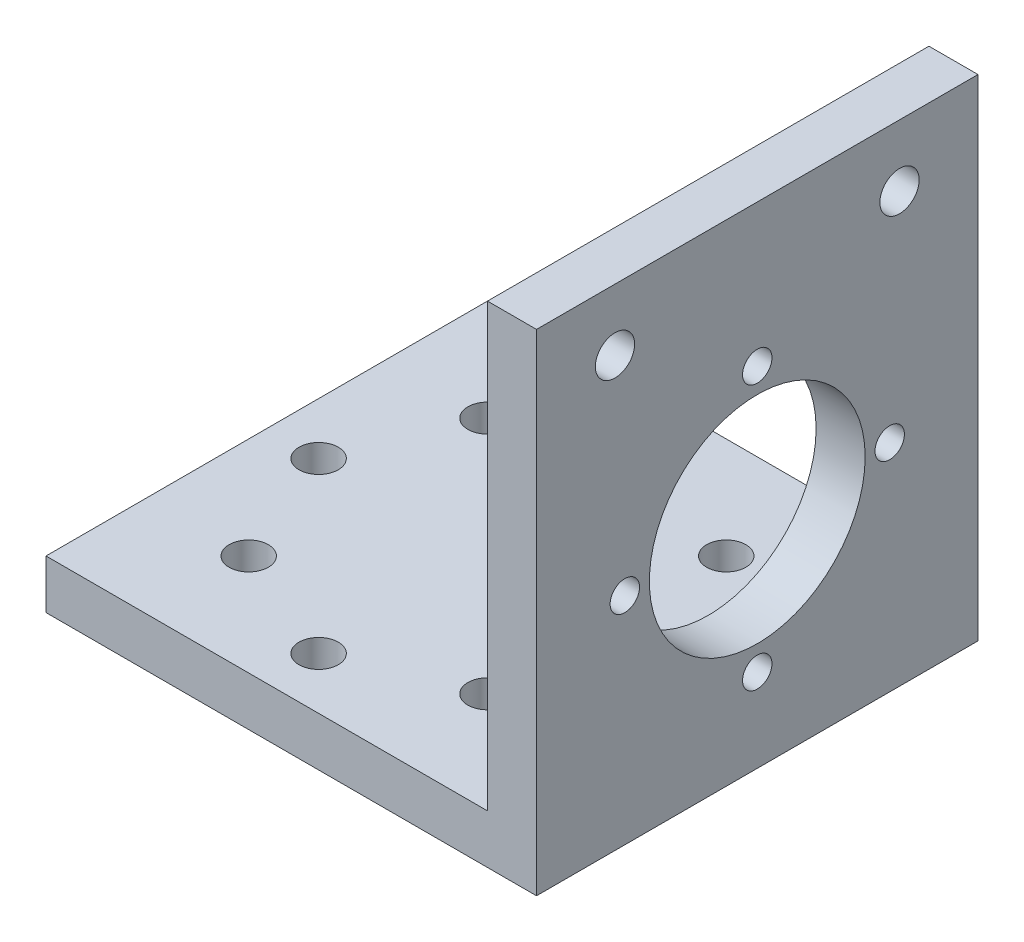
ISO-10303-21;
HEADER;
FILE_DESCRIPTION(('STEP AP214'),'2;1');
FILE_NAME('part.step','',(''),(''),'','','');
FILE_SCHEMA(('AUTOMOTIVE_DESIGN { 1 0 10303 214 1 1 1 1 }'));
ENDSEC;
DATA;
#1=APPLICATION_CONTEXT('core data for automotive mechanical design processes');
#2=APPLICATION_PROTOCOL_DEFINITION('international standard','automotive_design',2000,#1);
#3=PRODUCT_CONTEXT('',#1,'mechanical');
#4=PRODUCT('Part','Part','',(#3));
#5=PRODUCT_RELATED_PRODUCT_CATEGORY('part','',(#4));
#6=PRODUCT_DEFINITION_FORMATION('','',#4);
#7=PRODUCT_DEFINITION_CONTEXT('part definition',#1,'design');
#8=PRODUCT_DEFINITION('design','',#6,#7);
#9=PRODUCT_DEFINITION_SHAPE('','',#8);
#10=(LENGTH_UNIT() NAMED_UNIT(*) SI_UNIT(.MILLI.,.METRE.));
#11=(NAMED_UNIT(*) PLANE_ANGLE_UNIT() SI_UNIT($,.RADIAN.));
#12=(NAMED_UNIT(*) SI_UNIT($,.STERADIAN.) SOLID_ANGLE_UNIT());
#13=UNCERTAINTY_MEASURE_WITH_UNIT(LENGTH_MEASURE(1.E-05),#10,'distance_accuracy_value','');
#14=(GEOMETRIC_REPRESENTATION_CONTEXT(3) GLOBAL_UNCERTAINTY_ASSIGNED_CONTEXT((#13)) GLOBAL_UNIT_ASSIGNED_CONTEXT((#10,
#11,#12)) REPRESENTATION_CONTEXT('',''));
#15=CARTESIAN_POINT('',(0.,0.,0.));
#16=DIRECTION('',(0.,0.,1.));
#17=DIRECTION('',(1.,0.,0.));
#18=AXIS2_PLACEMENT_3D('',#15,#16,#17);
#19=CARTESIAN_POINT('',(-5.,50.,45.));
#20=DIRECTION('',(0.,-1.,0.));
#21=DIRECTION('',(0.,0.,-1.));
#22=AXIS2_PLACEMENT_3D('',#19,#20,#21);
#23=PLANE('',#22);
#24=DIRECTION('',(-1.,0.,0.));
#25=VECTOR('',#24,1.);
#26=CARTESIAN_POINT('',(-5.,50.,0.));
#27=LINE('',#26,#25);
#28=CARTESIAN_POINT('',(0.,50.,0.));
#29=VERTEX_POINT('',#28);
#30=CARTESIAN_POINT('',(-5.,50.,0.));
#31=VERTEX_POINT('',#30);
#32=EDGE_CURVE('E117',#29,#31,#27,.T.);
#33=ORIENTED_EDGE('',*,*,#32,.T.);
#34=DIRECTION('',(0.,0.,-1.));
#35=VECTOR('',#34,1.);
#36=CARTESIAN_POINT('',(-5.,50.,45.));
#37=LINE('',#36,#35);
#38=CARTESIAN_POINT('',(-5.,50.,45.));
#39=VERTEX_POINT('',#38);
#40=EDGE_CURVE('E11',#39,#31,#37,.T.);
#41=ORIENTED_EDGE('',*,*,#40,.F.);
#42=DIRECTION('',(-1.,0.,0.));
#43=VECTOR('',#42,1.);
#44=CARTESIAN_POINT('',(-5.,50.,45.));
#45=LINE('',#44,#43);
#46=CARTESIAN_POINT('',(0.,50.,45.));
#47=VERTEX_POINT('',#46);
#48=EDGE_CURVE('E128',#47,#39,#45,.T.);
#49=ORIENTED_EDGE('',*,*,#48,.F.);
#50=DIRECTION('',(0.,0.,-1.));
#51=VECTOR('',#50,1.);
#52=CARTESIAN_POINT('',(0.,50.,45.));
#53=LINE('',#52,#51);
#54=EDGE_CURVE('E113',#47,#29,#53,.T.);
#55=ORIENTED_EDGE('',*,*,#54,.T.);
#56=EDGE_LOOP('',(#33,#41,#49,#55));
#57=FACE_BOUND('',#56,.T.);
#58=ADVANCED_FACE('F33',(#57),#23,.F.);
#59=CARTESIAN_POINT('',(-5.,4.99999999999999,45.));
#60=DIRECTION('',(1.,0.,0.));
#61=DIRECTION('',(0.,1.,0.));
#62=AXIS2_PLACEMENT_3D('',#59,#60,#61);
#63=PLANE('',#62);
#64=CARTESIAN_POINT('',(-5.,43.7084479767676,37.));
#65=DIRECTION('',(1.,0.,0.));
#66=DIRECTION('',(0.,0.,-1.));
#67=AXIS2_PLACEMENT_3D('',#64,#65,#66);
#68=CIRCLE('',#67,2.);
#69=CARTESIAN_POINT('',(-5.,43.7084479767676,35.));
#70=VERTEX_POINT('',#69);
#71=EDGE_CURVE('E352',#70,#70,#68,.T.);
#72=ORIENTED_EDGE('',*,*,#71,.T.);
#73=EDGE_LOOP('',(#72));
#74=FACE_BOUND('',#73,.T.);
#75=CARTESIAN_POINT('',(-5.,43.7084479767676,8.00000000000001));
#76=DIRECTION('',(1.,0.,0.));
#77=DIRECTION('',(0.,0.,1.));
#78=AXIS2_PLACEMENT_3D('',#75,#76,#77);
#79=CIRCLE('',#78,2.);
#80=CARTESIAN_POINT('',(-5.,43.7084479767676,10.));
#81=VERTEX_POINT('',#80);
#82=EDGE_CURVE('E355',#81,#81,#79,.T.);
#83=ORIENTED_EDGE('',*,*,#82,.T.);
#84=EDGE_LOOP('',(#83));
#85=FACE_BOUND('',#84,.T.);
#86=CARTESIAN_POINT('',(-5.,35.5,22.5));
#87=DIRECTION('',(1.,0.,0.));
#88=DIRECTION('',(0.,0.,-1.));
#89=AXIS2_PLACEMENT_3D('',#86,#87,#88);
#90=CIRCLE('',#89,1.5);
#91=CARTESIAN_POINT('',(-5.,35.5,21.));
#92=VERTEX_POINT('',#91);
#93=EDGE_CURVE('E413',#92,#92,#90,.T.);
#94=ORIENTED_EDGE('',*,*,#93,.T.);
#95=EDGE_LOOP('',(#94));
#96=FACE_BOUND('',#95,.T.);
#97=CARTESIAN_POINT('',(-5.,22.,9.));
#98=DIRECTION('',(1.,0.,0.));
#99=DIRECTION('',(0.,0.,-1.));
#100=AXIS2_PLACEMENT_3D('',#97,#98,#99);
#101=CIRCLE('',#100,1.5);
#102=CARTESIAN_POINT('',(-5.,22.,7.5));
#103=VERTEX_POINT('',#102);
#104=EDGE_CURVE('E420',#103,#103,#101,.T.);
#105=ORIENTED_EDGE('',*,*,#104,.T.);
#106=EDGE_LOOP('',(#105));
#107=FACE_BOUND('',#106,.T.);
#108=CARTESIAN_POINT('',(-5.,8.50000000000001,22.5));
#109=DIRECTION('',(1.,0.,0.));
#110=DIRECTION('',(0.,0.,-1.));
#111=AXIS2_PLACEMENT_3D('',#108,#109,#110);
#112=CIRCLE('',#111,1.5);
#113=CARTESIAN_POINT('',(-5.,8.50000000000001,21.));
#114=VERTEX_POINT('',#113);
#115=EDGE_CURVE('E426',#114,#114,#112,.T.);
#116=ORIENTED_EDGE('',*,*,#115,.T.);
#117=EDGE_LOOP('',(#116));
#118=FACE_BOUND('',#117,.T.);
#119=CARTESIAN_POINT('',(-5.,22.,36.));
#120=DIRECTION('',(1.,0.,0.));
#121=DIRECTION('',(0.,0.,-1.));
#122=AXIS2_PLACEMENT_3D('',#119,#120,#121);
#123=CIRCLE('',#122,1.5);
#124=CARTESIAN_POINT('',(-5.,22.,34.5));
#125=VERTEX_POINT('',#124);
#126=EDGE_CURVE('E432',#125,#125,#123,.T.);
#127=ORIENTED_EDGE('',*,*,#126,.T.);
#128=EDGE_LOOP('',(#127));
#129=FACE_BOUND('',#128,.T.);
#130=CARTESIAN_POINT('',(-5.,22.,22.5));
#131=DIRECTION('',(1.,0.,0.));
#132=DIRECTION('',(0.,0.,-1.));
#133=AXIS2_PLACEMENT_3D('',#130,#131,#132);
#134=CIRCLE('',#133,11.);
#135=CARTESIAN_POINT('',(-5.,22.,11.5));
#136=VERTEX_POINT('',#135);
#137=EDGE_CURVE('E121',#136,#136,#134,.T.);
#138=ORIENTED_EDGE('',*,*,#137,.T.);
#139=EDGE_LOOP('',(#138));
#140=FACE_BOUND('',#139,.T.);
#141=DIRECTION('',(0.,-1.,0.));
#142=VECTOR('',#141,1.);
#143=CARTESIAN_POINT('',(-5.,4.99999999999999,0.));
#144=LINE('',#143,#142);
#145=CARTESIAN_POINT('',(-5.,4.99999999999999,0.));
#146=VERTEX_POINT('',#145);
#147=EDGE_CURVE('E120',#31,#146,#144,.T.);
#148=ORIENTED_EDGE('',*,*,#147,.T.);
#149=DIRECTION('',(0.,0.,-1.));
#150=VECTOR('',#149,1.);
#151=CARTESIAN_POINT('',(-5.,4.99999999999999,45.));
#152=LINE('',#151,#150);
#153=CARTESIAN_POINT('',(-5.,4.99999999999999,45.));
#154=VERTEX_POINT('',#153);
#155=EDGE_CURVE('E41',#154,#146,#152,.T.);
#156=ORIENTED_EDGE('',*,*,#155,.F.);
#157=DIRECTION('',(0.,-1.,0.));
#158=VECTOR('',#157,1.);
#159=CARTESIAN_POINT('',(-5.,4.99999999999999,45.));
#160=LINE('',#159,#158);
#161=EDGE_CURVE('E86',#39,#154,#160,.T.);
#162=ORIENTED_EDGE('',*,*,#161,.F.);
#163=ORIENTED_EDGE('',*,*,#40,.T.);
#164=EDGE_LOOP('',(#148,#156,#162,#163));
#165=FACE_BOUND('',#164,.T.);
#166=ADVANCED_FACE('F158',(#74,#85,#96,#107,#118,#129,#140,#165),#63,.F.);
#167=CARTESIAN_POINT('',(-50.,4.99999999999999,45.));
#168=DIRECTION('',(0.,-1.,0.));
#169=DIRECTION('',(0.,0.,-1.));
#170=AXIS2_PLACEMENT_3D('',#167,#168,#169);
#171=PLANE('',#170);
#172=CARTESIAN_POINT('',(-27.5,4.99999999999999,5.2902950931948));
#173=DIRECTION('',(0.,1.,0.));
#174=DIRECTION('',(0.,0.,1.));
#175=AXIS2_PLACEMENT_3D('',#172,#173,#174);
#176=CIRCLE('',#175,2.);
#177=CARTESIAN_POINT('',(-27.5,4.99999999999999,7.2902950931948));
#178=VERTEX_POINT('',#177);
#179=EDGE_CURVE('E369',#178,#178,#176,.T.);
#180=ORIENTED_EDGE('',*,*,#179,.F.);
#181=EDGE_LOOP('',(#180));
#182=FACE_BOUND('',#181,.T.);
#183=CARTESIAN_POINT('',(-15.3309009581786,4.99999999999999,10.3309009581786));
#184=DIRECTION('',(0.,1.,0.));
#185=DIRECTION('',(0.,0.,1.));
#186=AXIS2_PLACEMENT_3D('',#183,#184,#185);
#187=CIRCLE('',#186,2.);
#188=CARTESIAN_POINT('',(-15.3309009581786,4.99999999999999,12.3309009581786));
#189=VERTEX_POINT('',#188);
#190=EDGE_CURVE('E375',#189,#189,#187,.T.);
#191=ORIENTED_EDGE('',*,*,#190,.F.);
#192=EDGE_LOOP('',(#191));
#193=FACE_BOUND('',#192,.T.);
#194=CARTESIAN_POINT('',(-10.2902950931948,4.99999999999999,22.5));
#195=DIRECTION('',(0.,1.,0.));
#196=DIRECTION('',(0.,0.,1.));
#197=AXIS2_PLACEMENT_3D('',#194,#195,#196);
#198=CIRCLE('',#197,2.);
#199=CARTESIAN_POINT('',(-10.2902950931948,4.99999999999999,24.5));
#200=VERTEX_POINT('',#199);
#201=EDGE_CURVE('E381',#200,#200,#198,.T.);
#202=ORIENTED_EDGE('',*,*,#201,.F.);
#203=EDGE_LOOP('',(#202));
#204=FACE_BOUND('',#203,.T.);
#205=CARTESIAN_POINT('',(-15.3309009581786,4.99999999999999,34.6690990418213));
#206=DIRECTION('',(0.,1.,0.));
#207=DIRECTION('',(0.,0.,1.));
#208=AXIS2_PLACEMENT_3D('',#205,#206,#207);
#209=CIRCLE('',#208,2.);
#210=CARTESIAN_POINT('',(-15.3309009581786,4.99999999999999,36.6690990418213));
#211=VERTEX_POINT('',#210);
#212=EDGE_CURVE('E387',#211,#211,#209,.T.);
#213=ORIENTED_EDGE('',*,*,#212,.F.);
#214=EDGE_LOOP('',(#213));
#215=FACE_BOUND('',#214,.T.);
#216=CARTESIAN_POINT('',(-27.5,4.99999999999999,39.7097049068052));
#217=DIRECTION('',(0.,1.,0.));
#218=DIRECTION('',(0.,0.,1.));
#219=AXIS2_PLACEMENT_3D('',#216,#217,#218);
#220=CIRCLE('',#219,2.);
#221=CARTESIAN_POINT('',(-27.5,4.99999999999999,41.7097049068052));
#222=VERTEX_POINT('',#221);
#223=EDGE_CURVE('E393',#222,#222,#220,.T.);
#224=ORIENTED_EDGE('',*,*,#223,.F.);
#225=EDGE_LOOP('',(#224));
#226=FACE_BOUND('',#225,.T.);
#227=CARTESIAN_POINT('',(-39.6690990418213,4.99999999999999,34.6690990418213));
#228=DIRECTION('',(0.,1.,0.));
#229=DIRECTION('',(0.,0.,1.));
#230=AXIS2_PLACEMENT_3D('',#227,#228,#229);
#231=CIRCLE('',#230,2.);
#232=CARTESIAN_POINT('',(-39.6690990418213,4.99999999999999,36.6690990418213));
#233=VERTEX_POINT('',#232);
#234=EDGE_CURVE('E399',#233,#233,#231,.T.);
#235=ORIENTED_EDGE('',*,*,#234,.F.);
#236=EDGE_LOOP('',(#235));
#237=FACE_BOUND('',#236,.T.);
#238=CARTESIAN_POINT('',(-44.7097049068052,4.99999999999999,22.5));
#239=DIRECTION('',(0.,1.,0.));
#240=DIRECTION('',(0.,0.,1.));
#241=AXIS2_PLACEMENT_3D('',#238,#239,#240);
#242=CIRCLE('',#241,2.);
#243=CARTESIAN_POINT('',(-44.7097049068052,4.99999999999999,24.5));
#244=VERTEX_POINT('',#243);
#245=EDGE_CURVE('E405',#244,#244,#242,.T.);
#246=ORIENTED_EDGE('',*,*,#245,.F.);
#247=EDGE_LOOP('',(#246));
#248=FACE_BOUND('',#247,.T.);
#249=CARTESIAN_POINT('',(-39.6690990418214,4.99999999999999,10.3309009581786));
#250=DIRECTION('',(0.,1.,0.));
#251=DIRECTION('',(0.,0.,1.));
#252=AXIS2_PLACEMENT_3D('',#249,#250,#251);
#253=CIRCLE('',#252,2.);
#254=CARTESIAN_POINT('',(-39.6690990418214,4.99999999999999,12.3309009581786));
#255=VERTEX_POINT('',#254);
#256=EDGE_CURVE('E357',#255,#255,#253,.T.);
#257=ORIENTED_EDGE('',*,*,#256,.F.);
#258=EDGE_LOOP('',(#257));
#259=FACE_BOUND('',#258,.T.);
#260=DIRECTION('',(-1.,0.,0.));
#261=VECTOR('',#260,1.);
#262=CARTESIAN_POINT('',(-50.,4.99999999999999,0.));
#263=LINE('',#262,#261);
#264=CARTESIAN_POINT('',(-50.,4.99999999999999,0.));
#265=VERTEX_POINT('',#264);
#266=EDGE_CURVE('E123',#146,#265,#263,.T.);
#267=ORIENTED_EDGE('',*,*,#266,.T.);
#268=DIRECTION('',(0.,0.,-1.));
#269=VECTOR('',#268,1.);
#270=CARTESIAN_POINT('',(-50.,4.99999999999999,45.));
#271=LINE('',#270,#269);
#272=CARTESIAN_POINT('',(-50.,4.99999999999999,45.));
#273=VERTEX_POINT('',#272);
#274=EDGE_CURVE('E108',#273,#265,#271,.T.);
#275=ORIENTED_EDGE('',*,*,#274,.F.);
#276=DIRECTION('',(-1.,0.,0.));
#277=VECTOR('',#276,1.);
#278=CARTESIAN_POINT('',(-50.,4.99999999999999,45.));
#279=LINE('',#278,#277);
#280=EDGE_CURVE('E99',#154,#273,#279,.T.);
#281=ORIENTED_EDGE('',*,*,#280,.F.);
#282=ORIENTED_EDGE('',*,*,#155,.T.);
#283=EDGE_LOOP('',(#267,#275,#281,#282));
#284=FACE_BOUND('',#283,.T.);
#285=ADVANCED_FACE('F134',(#182,#193,#204,#215,#226,#237,#248,#259,#284),#171,.F.);
#286=CARTESIAN_POINT('',(-50.,0.,45.));
#287=DIRECTION('',(1.,0.,0.));
#288=DIRECTION('',(0.,0.,-1.));
#289=AXIS2_PLACEMENT_3D('',#286,#287,#288);
#290=PLANE('',#289);
#291=DIRECTION('',(0.,-1.,0.));
#292=VECTOR('',#291,1.);
#293=CARTESIAN_POINT('',(-50.,0.,0.));
#294=LINE('',#293,#292);
#295=CARTESIAN_POINT('',(-50.,0.,0.));
#296=VERTEX_POINT('',#295);
#297=EDGE_CURVE('E107',#265,#296,#294,.T.);
#298=ORIENTED_EDGE('',*,*,#297,.T.);
#299=DIRECTION('',(0.,0.,-1.));
#300=VECTOR('',#299,1.);
#301=CARTESIAN_POINT('',(-50.,0.,45.));
#302=LINE('',#301,#300);
#303=CARTESIAN_POINT('',(-50.,0.,45.));
#304=VERTEX_POINT('',#303);
#305=EDGE_CURVE('E104',#304,#296,#302,.T.);
#306=ORIENTED_EDGE('',*,*,#305,.F.);
#307=DIRECTION('',(0.,-1.,0.));
#308=VECTOR('',#307,1.);
#309=CARTESIAN_POINT('',(-50.,0.,45.));
#310=LINE('',#309,#308);
#311=EDGE_CURVE('E93',#273,#304,#310,.T.);
#312=ORIENTED_EDGE('',*,*,#311,.F.);
#313=ORIENTED_EDGE('',*,*,#274,.T.);
#314=EDGE_LOOP('',(#298,#306,#312,#313));
#315=FACE_BOUND('',#314,.T.);
#316=ADVANCED_FACE('F105',(#315),#290,.F.);
#317=CARTESIAN_POINT('',(0.,0.,45.));
#318=DIRECTION('',(0.,1.,0.));
#319=DIRECTION('',(-1.,0.,0.));
#320=AXIS2_PLACEMENT_3D('',#317,#318,#319);
#321=PLANE('',#320);
#322=CARTESIAN_POINT('',(-27.5,0.,5.2902950931948));
#323=DIRECTION('',(0.,1.,0.));
#324=DIRECTION('',(0.,0.,1.));
#325=AXIS2_PLACEMENT_3D('',#322,#323,#324);
#326=CIRCLE('',#325,2.);
#327=CARTESIAN_POINT('',(-27.5,0.,7.2902950931948));
#328=VERTEX_POINT('',#327);
#329=EDGE_CURVE('E365',#328,#328,#326,.T.);
#330=ORIENTED_EDGE('',*,*,#329,.T.);
#331=EDGE_LOOP('',(#330));
#332=FACE_BOUND('',#331,.T.);
#333=CARTESIAN_POINT('',(-15.3309009581786,0.,10.3309009581786));
#334=DIRECTION('',(0.,1.,0.));
#335=DIRECTION('',(0.,0.,1.));
#336=AXIS2_PLACEMENT_3D('',#333,#334,#335);
#337=CIRCLE('',#336,2.);
#338=CARTESIAN_POINT('',(-15.3309009581786,0.,12.3309009581786));
#339=VERTEX_POINT('',#338);
#340=EDGE_CURVE('E372',#339,#339,#337,.T.);
#341=ORIENTED_EDGE('',*,*,#340,.T.);
#342=EDGE_LOOP('',(#341));
#343=FACE_BOUND('',#342,.T.);
#344=CARTESIAN_POINT('',(-10.2902950931948,0.,22.5));
#345=DIRECTION('',(0.,1.,0.));
#346=DIRECTION('',(0.,0.,1.));
#347=AXIS2_PLACEMENT_3D('',#344,#345,#346);
#348=CIRCLE('',#347,2.);
#349=CARTESIAN_POINT('',(-10.2902950931948,0.,24.5));
#350=VERTEX_POINT('',#349);
#351=EDGE_CURVE('E378',#350,#350,#348,.T.);
#352=ORIENTED_EDGE('',*,*,#351,.T.);
#353=EDGE_LOOP('',(#352));
#354=FACE_BOUND('',#353,.T.);
#355=CARTESIAN_POINT('',(-15.3309009581786,0.,34.6690990418213));
#356=DIRECTION('',(0.,1.,0.));
#357=DIRECTION('',(0.,0.,1.));
#358=AXIS2_PLACEMENT_3D('',#355,#356,#357);
#359=CIRCLE('',#358,2.);
#360=CARTESIAN_POINT('',(-15.3309009581786,0.,36.6690990418213));
#361=VERTEX_POINT('',#360);
#362=EDGE_CURVE('E384',#361,#361,#359,.T.);
#363=ORIENTED_EDGE('',*,*,#362,.T.);
#364=EDGE_LOOP('',(#363));
#365=FACE_BOUND('',#364,.T.);
#366=CARTESIAN_POINT('',(-27.5,0.,39.7097049068052));
#367=DIRECTION('',(0.,1.,0.));
#368=DIRECTION('',(0.,0.,1.));
#369=AXIS2_PLACEMENT_3D('',#366,#367,#368);
#370=CIRCLE('',#369,2.);
#371=CARTESIAN_POINT('',(-27.5,0.,41.7097049068052));
#372=VERTEX_POINT('',#371);
#373=EDGE_CURVE('E390',#372,#372,#370,.T.);
#374=ORIENTED_EDGE('',*,*,#373,.T.);
#375=EDGE_LOOP('',(#374));
#376=FACE_BOUND('',#375,.T.);
#377=CARTESIAN_POINT('',(-39.6690990418213,0.,34.6690990418213));
#378=DIRECTION('',(0.,1.,0.));
#379=DIRECTION('',(0.,0.,1.));
#380=AXIS2_PLACEMENT_3D('',#377,#378,#379);
#381=CIRCLE('',#380,2.);
#382=CARTESIAN_POINT('',(-39.6690990418213,0.,36.6690990418213));
#383=VERTEX_POINT('',#382);
#384=EDGE_CURVE('E396',#383,#383,#381,.T.);
#385=ORIENTED_EDGE('',*,*,#384,.T.);
#386=EDGE_LOOP('',(#385));
#387=FACE_BOUND('',#386,.T.);
#388=CARTESIAN_POINT('',(-44.7097049068052,0.,22.5));
#389=DIRECTION('',(0.,1.,0.));
#390=DIRECTION('',(0.,0.,1.));
#391=AXIS2_PLACEMENT_3D('',#388,#389,#390);
#392=CIRCLE('',#391,2.);
#393=CARTESIAN_POINT('',(-44.7097049068052,0.,24.5));
#394=VERTEX_POINT('',#393);
#395=EDGE_CURVE('E402',#394,#394,#392,.T.);
#396=ORIENTED_EDGE('',*,*,#395,.T.);
#397=EDGE_LOOP('',(#396));
#398=FACE_BOUND('',#397,.T.);
#399=CARTESIAN_POINT('',(-39.6690990418214,0.,10.3309009581786));
#400=DIRECTION('',(0.,1.,0.));
#401=DIRECTION('',(0.,0.,1.));
#402=AXIS2_PLACEMENT_3D('',#399,#400,#401);
#403=CIRCLE('',#402,2.);
#404=CARTESIAN_POINT('',(-39.6690990418214,0.,12.3309009581786));
#405=VERTEX_POINT('',#404);
#406=EDGE_CURVE('E408',#405,#405,#403,.T.);
#407=ORIENTED_EDGE('',*,*,#406,.T.);
#408=EDGE_LOOP('',(#407));
#409=FACE_BOUND('',#408,.T.);
#410=DIRECTION('',(1.,0.,0.));
#411=VECTOR('',#410,1.);
#412=CARTESIAN_POINT('',(0.,0.,0.));
#413=LINE('',#412,#411);
#414=CARTESIAN_POINT('',(0.,0.,0.));
#415=VERTEX_POINT('',#414);
#416=EDGE_CURVE('E72',#296,#415,#413,.T.);
#417=ORIENTED_EDGE('',*,*,#416,.T.);
#418=DIRECTION('',(0.,0.,-1.));
#419=VECTOR('',#418,1.);
#420=CARTESIAN_POINT('',(0.,0.,45.));
#421=LINE('',#420,#419);
#422=CARTESIAN_POINT('',(0.,0.,45.));
#423=VERTEX_POINT('',#422);
#424=EDGE_CURVE('E109',#423,#415,#421,.T.);
#425=ORIENTED_EDGE('',*,*,#424,.F.);
#426=DIRECTION('',(1.,0.,0.));
#427=VECTOR('',#426,1.);
#428=CARTESIAN_POINT('',(0.,0.,45.));
#429=LINE('',#428,#427);
#430=EDGE_CURVE('E97',#304,#423,#429,.T.);
#431=ORIENTED_EDGE('',*,*,#430,.F.);
#432=ORIENTED_EDGE('',*,*,#305,.T.);
#433=EDGE_LOOP('',(#417,#425,#431,#432));
#434=FACE_BOUND('',#433,.T.);
#435=ADVANCED_FACE('F111',(#332,#343,#354,#365,#376,#387,#398,#409,#434),#321,.F.);
#436=CARTESIAN_POINT('',(0.,50.,45.));
#437=DIRECTION('',(-1.,0.,0.));
#438=DIRECTION('',(0.,0.,1.));
#439=AXIS2_PLACEMENT_3D('',#436,#437,#438);
#440=PLANE('',#439);
#441=CARTESIAN_POINT('',(0.,43.7084479767676,37.));
#442=DIRECTION('',(1.,0.,0.));
#443=DIRECTION('',(0.,0.,-1.));
#444=AXIS2_PLACEMENT_3D('',#441,#442,#443);
#445=CIRCLE('',#444,2.);
#446=CARTESIAN_POINT('',(0.,43.7084479767676,35.));
#447=VERTEX_POINT('',#446);
#448=EDGE_CURVE('E354',#447,#447,#445,.T.);
#449=ORIENTED_EDGE('',*,*,#448,.F.);
#450=EDGE_LOOP('',(#449));
#451=FACE_BOUND('',#450,.T.);
#452=CARTESIAN_POINT('',(0.,43.7084479767676,8.00000000000001));
#453=DIRECTION('',(1.,0.,0.));
#454=DIRECTION('',(0.,0.,1.));
#455=AXIS2_PLACEMENT_3D('',#452,#453,#454);
#456=CIRCLE('',#455,2.);
#457=CARTESIAN_POINT('',(0.,43.7084479767676,10.));
#458=VERTEX_POINT('',#457);
#459=EDGE_CURVE('E360',#458,#458,#456,.T.);
#460=ORIENTED_EDGE('',*,*,#459,.F.);
#461=EDGE_LOOP('',(#460));
#462=FACE_BOUND('',#461,.T.);
#463=CARTESIAN_POINT('',(0.,35.5,22.5));
#464=DIRECTION('',(1.,0.,0.));
#465=DIRECTION('',(0.,0.,-1.));
#466=AXIS2_PLACEMENT_3D('',#463,#464,#465);
#467=CIRCLE('',#466,1.5);
#468=CARTESIAN_POINT('',(0.,35.5,21.));
#469=VERTEX_POINT('',#468);
#470=EDGE_CURVE('E417',#469,#469,#467,.T.);
#471=ORIENTED_EDGE('',*,*,#470,.F.);
#472=EDGE_LOOP('',(#471));
#473=FACE_BOUND('',#472,.T.);
#474=CARTESIAN_POINT('',(0.,22.,9.));
#475=DIRECTION('',(1.,0.,0.));
#476=DIRECTION('',(0.,0.,-1.));
#477=AXIS2_PLACEMENT_3D('',#474,#475,#476);
#478=CIRCLE('',#477,1.5);
#479=CARTESIAN_POINT('',(0.,22.,7.5));
#480=VERTEX_POINT('',#479);
#481=EDGE_CURVE('E423',#480,#480,#478,.T.);
#482=ORIENTED_EDGE('',*,*,#481,.F.);
#483=EDGE_LOOP('',(#482));
#484=FACE_BOUND('',#483,.T.);
#485=CARTESIAN_POINT('',(0.,8.50000000000001,22.5));
#486=DIRECTION('',(1.,0.,0.));
#487=DIRECTION('',(0.,0.,-1.));
#488=AXIS2_PLACEMENT_3D('',#485,#486,#487);
#489=CIRCLE('',#488,1.5);
#490=CARTESIAN_POINT('',(0.,8.50000000000001,21.));
#491=VERTEX_POINT('',#490);
#492=EDGE_CURVE('E429',#491,#491,#489,.T.);
#493=ORIENTED_EDGE('',*,*,#492,.F.);
#494=EDGE_LOOP('',(#493));
#495=FACE_BOUND('',#494,.T.);
#496=CARTESIAN_POINT('',(0.,22.,36.));
#497=DIRECTION('',(1.,0.,0.));
#498=DIRECTION('',(0.,0.,-1.));
#499=AXIS2_PLACEMENT_3D('',#496,#497,#498);
#500=CIRCLE('',#499,1.5);
#501=CARTESIAN_POINT('',(0.,22.,34.5));
#502=VERTEX_POINT('',#501);
#503=EDGE_CURVE('E368',#502,#502,#500,.T.);
#504=ORIENTED_EDGE('',*,*,#503,.F.);
#505=EDGE_LOOP('',(#504));
#506=FACE_BOUND('',#505,.T.);
#507=CARTESIAN_POINT('',(0.,22.,22.5));
#508=DIRECTION('',(1.,0.,0.));
#509=DIRECTION('',(0.,0.,-1.));
#510=AXIS2_PLACEMENT_3D('',#507,#508,#509);
#511=CIRCLE('',#510,11.);
#512=CARTESIAN_POINT('',(0.,22.,11.5));
#513=VERTEX_POINT('',#512);
#514=EDGE_CURVE('E416',#513,#513,#511,.T.);
#515=ORIENTED_EDGE('',*,*,#514,.F.);
#516=EDGE_LOOP('',(#515));
#517=FACE_BOUND('',#516,.T.);
#518=DIRECTION('',(0.,1.,0.));
#519=VECTOR('',#518,1.);
#520=CARTESIAN_POINT('',(0.,50.,0.));
#521=LINE('',#520,#519);
#522=EDGE_CURVE('E78',#415,#29,#521,.T.);
#523=ORIENTED_EDGE('',*,*,#522,.T.);
#524=ORIENTED_EDGE('',*,*,#54,.F.);
#525=DIRECTION('',(0.,1.,0.));
#526=VECTOR('',#525,1.);
#527=CARTESIAN_POINT('',(0.,50.,45.));
#528=LINE('',#527,#526);
#529=EDGE_CURVE('E49',#423,#47,#528,.T.);
#530=ORIENTED_EDGE('',*,*,#529,.F.);
#531=ORIENTED_EDGE('',*,*,#424,.T.);
#532=EDGE_LOOP('',(#523,#524,#530,#531));
#533=FACE_BOUND('',#532,.T.);
#534=ADVANCED_FACE('F141',(#451,#462,#473,#484,#495,#506,#517,#533),#440,.F.);
#535=CARTESIAN_POINT('',(0.,0.,45.));
#536=DIRECTION('',(0.,0.,-1.));
#537=DIRECTION('',(-1.,0.,0.));
#538=AXIS2_PLACEMENT_3D('',#535,#536,#537);
#539=PLANE('',#538);
#540=ORIENTED_EDGE('',*,*,#48,.T.);
#541=ORIENTED_EDGE('',*,*,#161,.T.);
#542=ORIENTED_EDGE('',*,*,#280,.T.);
#543=ORIENTED_EDGE('',*,*,#311,.T.);
#544=ORIENTED_EDGE('',*,*,#430,.T.);
#545=ORIENTED_EDGE('',*,*,#529,.T.);
#546=EDGE_LOOP('',(#540,#541,#542,#543,#544,#545));
#547=FACE_BOUND('',#546,.T.);
#548=ADVANCED_FACE('F95',(#547),#539,.F.);
#549=CARTESIAN_POINT('',(0.,0.,0.));
#550=DIRECTION('',(0.,0.,-1.));
#551=DIRECTION('',(-1.,0.,0.));
#552=AXIS2_PLACEMENT_3D('',#549,#550,#551);
#553=PLANE('',#552);
#554=ORIENTED_EDGE('',*,*,#32,.F.);
#555=ORIENTED_EDGE('',*,*,#522,.F.);
#556=ORIENTED_EDGE('',*,*,#416,.F.);
#557=ORIENTED_EDGE('',*,*,#297,.F.);
#558=ORIENTED_EDGE('',*,*,#266,.F.);
#559=ORIENTED_EDGE('',*,*,#147,.F.);
#560=EDGE_LOOP('',(#554,#555,#556,#557,#558,#559));
#561=FACE_BOUND('',#560,.T.);
#562=ADVANCED_FACE('F137',(#561),#553,.T.);
#563=CARTESIAN_POINT('',(-5.,22.,22.5));
#564=DIRECTION('',(1.,0.,0.));
#565=DIRECTION('',(0.,0.,-1.));
#566=AXIS2_PLACEMENT_3D('',#563,#564,#565);
#567=CYLINDRICAL_SURFACE('',#566,11.);
#568=ORIENTED_EDGE('',*,*,#137,.F.);
#569=EDGE_LOOP('',(#568));
#570=FACE_BOUND('',#569,.T.);
#571=ORIENTED_EDGE('',*,*,#514,.T.);
#572=EDGE_LOOP('',(#571));
#573=FACE_BOUND('',#572,.T.);
#574=ADVANCED_FACE('F198',(#570,#573),#567,.F.);
#575=CARTESIAN_POINT('',(-5.,22.,36.));
#576=DIRECTION('',(1.,0.,0.));
#577=DIRECTION('',(0.,0.,-1.));
#578=AXIS2_PLACEMENT_3D('',#575,#576,#577);
#579=CYLINDRICAL_SURFACE('',#578,1.5);
#580=ORIENTED_EDGE('',*,*,#126,.F.);
#581=EDGE_LOOP('',(#580));
#582=FACE_BOUND('',#581,.T.);
#583=ORIENTED_EDGE('',*,*,#503,.T.);
#584=EDGE_LOOP('',(#583));
#585=FACE_BOUND('',#584,.T.);
#586=ADVANCED_FACE('F204',(#582,#585),#579,.F.);
#587=CARTESIAN_POINT('',(-5.,8.50000000000001,22.5));
#588=DIRECTION('',(1.,0.,0.));
#589=DIRECTION('',(0.,0.,-1.));
#590=AXIS2_PLACEMENT_3D('',#587,#588,#589);
#591=CYLINDRICAL_SURFACE('',#590,1.5);
#592=ORIENTED_EDGE('',*,*,#115,.F.);
#593=EDGE_LOOP('',(#592));
#594=FACE_BOUND('',#593,.T.);
#595=ORIENTED_EDGE('',*,*,#492,.T.);
#596=EDGE_LOOP('',(#595));
#597=FACE_BOUND('',#596,.T.);
#598=ADVANCED_FACE('F212',(#594,#597),#591,.F.);
#599=CARTESIAN_POINT('',(-5.,22.,9.));
#600=DIRECTION('',(1.,0.,0.));
#601=DIRECTION('',(0.,0.,-1.));
#602=AXIS2_PLACEMENT_3D('',#599,#600,#601);
#603=CYLINDRICAL_SURFACE('',#602,1.5);
#604=ORIENTED_EDGE('',*,*,#104,.F.);
#605=EDGE_LOOP('',(#604));
#606=FACE_BOUND('',#605,.T.);
#607=ORIENTED_EDGE('',*,*,#481,.T.);
#608=EDGE_LOOP('',(#607));
#609=FACE_BOUND('',#608,.T.);
#610=ADVANCED_FACE('F220',(#606,#609),#603,.F.);
#611=CARTESIAN_POINT('',(-5.,35.5,22.5));
#612=DIRECTION('',(1.,0.,0.));
#613=DIRECTION('',(0.,0.,-1.));
#614=AXIS2_PLACEMENT_3D('',#611,#612,#613);
#615=CYLINDRICAL_SURFACE('',#614,1.5);
#616=ORIENTED_EDGE('',*,*,#93,.F.);
#617=EDGE_LOOP('',(#616));
#618=FACE_BOUND('',#617,.T.);
#619=ORIENTED_EDGE('',*,*,#470,.T.);
#620=EDGE_LOOP('',(#619));
#621=FACE_BOUND('',#620,.T.);
#622=ADVANCED_FACE('F228',(#618,#621),#615,.F.);
#623=CARTESIAN_POINT('',(-39.6690990418214,0.,10.3309009581786));
#624=DIRECTION('',(0.,1.,0.));
#625=DIRECTION('',(0.,0.,1.));
#626=AXIS2_PLACEMENT_3D('',#623,#624,#625);
#627=CYLINDRICAL_SURFACE('',#626,2.);
#628=ORIENTED_EDGE('',*,*,#406,.F.);
#629=EDGE_LOOP('',(#628));
#630=FACE_BOUND('',#629,.T.);
#631=ORIENTED_EDGE('',*,*,#256,.T.);
#632=EDGE_LOOP('',(#631));
#633=FACE_BOUND('',#632,.T.);
#634=ADVANCED_FACE('F236',(#630,#633),#627,.F.);
#635=CARTESIAN_POINT('',(-44.7097049068052,0.,22.5));
#636=DIRECTION('',(0.,1.,0.));
#637=DIRECTION('',(0.,0.,1.));
#638=AXIS2_PLACEMENT_3D('',#635,#636,#637);
#639=CYLINDRICAL_SURFACE('',#638,2.);
#640=ORIENTED_EDGE('',*,*,#395,.F.);
#641=EDGE_LOOP('',(#640));
#642=FACE_BOUND('',#641,.T.);
#643=ORIENTED_EDGE('',*,*,#245,.T.);
#644=EDGE_LOOP('',(#643));
#645=FACE_BOUND('',#644,.T.);
#646=ADVANCED_FACE('F243',(#642,#645),#639,.F.);
#647=CARTESIAN_POINT('',(-39.6690990418213,0.,34.6690990418213));
#648=DIRECTION('',(0.,1.,0.));
#649=DIRECTION('',(0.,0.,1.));
#650=AXIS2_PLACEMENT_3D('',#647,#648,#649);
#651=CYLINDRICAL_SURFACE('',#650,2.);
#652=ORIENTED_EDGE('',*,*,#384,.F.);
#653=EDGE_LOOP('',(#652));
#654=FACE_BOUND('',#653,.T.);
#655=ORIENTED_EDGE('',*,*,#234,.T.);
#656=EDGE_LOOP('',(#655));
#657=FACE_BOUND('',#656,.T.);
#658=ADVANCED_FACE('F251',(#654,#657),#651,.F.);
#659=CARTESIAN_POINT('',(-27.5,0.,39.7097049068052));
#660=DIRECTION('',(0.,1.,0.));
#661=DIRECTION('',(0.,0.,1.));
#662=AXIS2_PLACEMENT_3D('',#659,#660,#661);
#663=CYLINDRICAL_SURFACE('',#662,2.);
#664=ORIENTED_EDGE('',*,*,#373,.F.);
#665=EDGE_LOOP('',(#664));
#666=FACE_BOUND('',#665,.T.);
#667=ORIENTED_EDGE('',*,*,#223,.T.);
#668=EDGE_LOOP('',(#667));
#669=FACE_BOUND('',#668,.T.);
#670=ADVANCED_FACE('F259',(#666,#669),#663,.F.);
#671=CARTESIAN_POINT('',(-15.3309009581786,0.,34.6690990418213));
#672=DIRECTION('',(0.,1.,0.));
#673=DIRECTION('',(0.,0.,1.));
#674=AXIS2_PLACEMENT_3D('',#671,#672,#673);
#675=CYLINDRICAL_SURFACE('',#674,2.);
#676=ORIENTED_EDGE('',*,*,#362,.F.);
#677=EDGE_LOOP('',(#676));
#678=FACE_BOUND('',#677,.T.);
#679=ORIENTED_EDGE('',*,*,#212,.T.);
#680=EDGE_LOOP('',(#679));
#681=FACE_BOUND('',#680,.T.);
#682=ADVANCED_FACE('F267',(#678,#681),#675,.F.);
#683=CARTESIAN_POINT('',(-10.2902950931948,0.,22.5));
#684=DIRECTION('',(0.,1.,0.));
#685=DIRECTION('',(0.,0.,1.));
#686=AXIS2_PLACEMENT_3D('',#683,#684,#685);
#687=CYLINDRICAL_SURFACE('',#686,2.);
#688=ORIENTED_EDGE('',*,*,#351,.F.);
#689=EDGE_LOOP('',(#688));
#690=FACE_BOUND('',#689,.T.);
#691=ORIENTED_EDGE('',*,*,#201,.T.);
#692=EDGE_LOOP('',(#691));
#693=FACE_BOUND('',#692,.T.);
#694=ADVANCED_FACE('F275',(#690,#693),#687,.F.);
#695=CARTESIAN_POINT('',(-15.3309009581786,0.,10.3309009581786));
#696=DIRECTION('',(0.,1.,0.));
#697=DIRECTION('',(0.,0.,1.));
#698=AXIS2_PLACEMENT_3D('',#695,#696,#697);
#699=CYLINDRICAL_SURFACE('',#698,2.);
#700=ORIENTED_EDGE('',*,*,#340,.F.);
#701=EDGE_LOOP('',(#700));
#702=FACE_BOUND('',#701,.T.);
#703=ORIENTED_EDGE('',*,*,#190,.T.);
#704=EDGE_LOOP('',(#703));
#705=FACE_BOUND('',#704,.T.);
#706=ADVANCED_FACE('F283',(#702,#705),#699,.F.);
#707=CARTESIAN_POINT('',(-27.5,0.,5.2902950931948));
#708=DIRECTION('',(0.,1.,0.));
#709=DIRECTION('',(0.,0.,1.));
#710=AXIS2_PLACEMENT_3D('',#707,#708,#709);
#711=CYLINDRICAL_SURFACE('',#710,2.);
#712=ORIENTED_EDGE('',*,*,#329,.F.);
#713=EDGE_LOOP('',(#712));
#714=FACE_BOUND('',#713,.T.);
#715=ORIENTED_EDGE('',*,*,#179,.T.);
#716=EDGE_LOOP('',(#715));
#717=FACE_BOUND('',#716,.T.);
#718=ADVANCED_FACE('F291',(#714,#717),#711,.F.);
#719=CARTESIAN_POINT('',(-5.,43.7084479767676,8.00000000000001));
#720=DIRECTION('',(1.,0.,0.));
#721=DIRECTION('',(0.,0.,-1.));
#722=AXIS2_PLACEMENT_3D('',#719,#720,#721);
#723=CYLINDRICAL_SURFACE('',#722,2.);
#724=ORIENTED_EDGE('',*,*,#82,.F.);
#725=EDGE_LOOP('',(#724));
#726=FACE_BOUND('',#725,.T.);
#727=ORIENTED_EDGE('',*,*,#459,.T.);
#728=EDGE_LOOP('',(#727));
#729=FACE_BOUND('',#728,.T.);
#730=ADVANCED_FACE('F298',(#726,#729),#723,.F.);
#731=CARTESIAN_POINT('',(-5.,43.7084479767676,37.));
#732=DIRECTION('',(1.,0.,0.));
#733=DIRECTION('',(0.,0.,-1.));
#734=AXIS2_PLACEMENT_3D('',#731,#732,#733);
#735=CYLINDRICAL_SURFACE('',#734,2.);
#736=ORIENTED_EDGE('',*,*,#71,.F.);
#737=EDGE_LOOP('',(#736));
#738=FACE_BOUND('',#737,.T.);
#739=ORIENTED_EDGE('',*,*,#448,.T.);
#740=EDGE_LOOP('',(#739));
#741=FACE_BOUND('',#740,.T.);
#742=ADVANCED_FACE('F305',(#738,#741),#735,.F.);
#743=CLOSED_SHELL('',(#58,#166,#285,#316,#435,#534,#548,#562,#574,#586,#598,#610,#622,#634,#646,
#658,#670,#682,#694,#706,#718,#730,#742));
#744=MANIFOLD_SOLID_BREP('B2',#743);
#745=ADVANCED_BREP_SHAPE_REPRESENTATION('',(#18,#744),#14);
#746=SHAPE_DEFINITION_REPRESENTATION(#9,#745);
ENDSEC;
END-ISO-10303-21;
